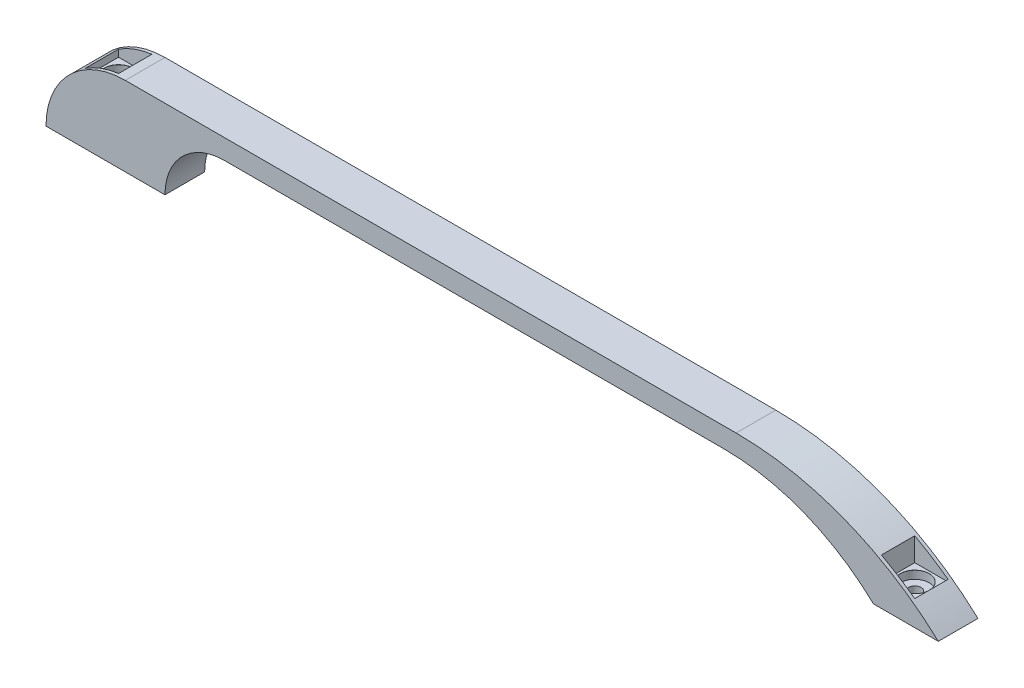
ISO-10303-21;
HEADER;
FILE_DESCRIPTION(('STEP AP214'),'2;1');
FILE_NAME('part.step','',(''),(''),'','','');
FILE_SCHEMA(('AUTOMOTIVE_DESIGN { 1 0 10303 214 1 1 1 1 }'));
ENDSEC;
DATA;
#1=APPLICATION_CONTEXT('core data for automotive mechanical design processes');
#2=APPLICATION_PROTOCOL_DEFINITION('international standard','automotive_design',2000,#1);
#3=PRODUCT_CONTEXT('',#1,'mechanical');
#4=PRODUCT('Part','Part','',(#3));
#5=PRODUCT_RELATED_PRODUCT_CATEGORY('part','',(#4));
#6=PRODUCT_DEFINITION_FORMATION('','',#4);
#7=PRODUCT_DEFINITION_CONTEXT('part definition',#1,'design');
#8=PRODUCT_DEFINITION('design','',#6,#7);
#9=PRODUCT_DEFINITION_SHAPE('','',#8);
#10=(LENGTH_UNIT() NAMED_UNIT(*) SI_UNIT(.MILLI.,.METRE.));
#11=(NAMED_UNIT(*) PLANE_ANGLE_UNIT() SI_UNIT($,.RADIAN.));
#12=(NAMED_UNIT(*) SI_UNIT($,.STERADIAN.) SOLID_ANGLE_UNIT());
#13=UNCERTAINTY_MEASURE_WITH_UNIT(LENGTH_MEASURE(1.E-05),#10,'distance_accuracy_value','');
#14=(GEOMETRIC_REPRESENTATION_CONTEXT(3) GLOBAL_UNCERTAINTY_ASSIGNED_CONTEXT((#13)) GLOBAL_UNIT_ASSIGNED_CONTEXT((#10,
#11,#12)) REPRESENTATION_CONTEXT('',''));
#15=CARTESIAN_POINT('',(0.,0.,0.));
#16=DIRECTION('',(0.,0.,1.));
#17=DIRECTION('',(1.,0.,0.));
#18=AXIS2_PLACEMENT_3D('',#15,#16,#17);
#19=CARTESIAN_POINT('',(348.019609728144,-110.,20.));
#20=DIRECTION('',(0.,0.,-1.));
#21=DIRECTION('',(-1.,0.,0.));
#22=AXIS2_PLACEMENT_3D('',#19,#20,#21);
#23=CYLINDRICAL_SURFACE('',#22,150.);
#24=CARTESIAN_POINT('',(348.019609728144,-110.,0.));
#25=DIRECTION('',(0.,0.,1.));
#26=DIRECTION('',(-1.,0.,0.));
#27=AXIS2_PLACEMENT_3D('',#24,#25,#26);
#28=CIRCLE('',#27,150.);
#29=CARTESIAN_POINT('',(450.,0.,0.));
#30=VERTEX_POINT('',#29);
#31=CARTESIAN_POINT('',(348.019609728144,40.,0.));
#32=VERTEX_POINT('',#31);
#33=EDGE_CURVE('E276',#30,#32,#28,.T.);
#34=ORIENTED_EDGE('',*,*,#33,.T.);
#35=DIRECTION('',(0.,0.,-1.));
#36=VECTOR('',#35,1.);
#37=CARTESIAN_POINT('',(348.019609728144,40.,20.));
#38=LINE('',#37,#36);
#39=CARTESIAN_POINT('',(348.019609728144,40.,20.));
#40=VERTEX_POINT('',#39);
#41=EDGE_CURVE('E284',#40,#32,#38,.T.);
#42=ORIENTED_EDGE('',*,*,#41,.F.);
#43=CARTESIAN_POINT('',(348.019609728144,-110.,20.));
#44=DIRECTION('',(0.,0.,1.));
#45=DIRECTION('',(-1.,0.,0.));
#46=AXIS2_PLACEMENT_3D('',#43,#44,#45);
#47=CIRCLE('',#46,150.);
#48=CARTESIAN_POINT('',(450.,0.,20.));
#49=VERTEX_POINT('',#48);
#50=EDGE_CURVE('E250',#49,#40,#47,.T.);
#51=ORIENTED_EDGE('',*,*,#50,.F.);
#52=DIRECTION('',(0.,0.,-1.));
#53=VECTOR('',#52,1.);
#54=CARTESIAN_POINT('',(450.,0.,20.));
#55=LINE('',#54,#53);
#56=EDGE_CURVE('E288',#49,#30,#55,.T.);
#57=ORIENTED_EDGE('',*,*,#56,.T.);
#58=EDGE_LOOP('',(#34,#42,#51,#57));
#59=FACE_BOUND('',#58,.T.);
#60=DIRECTION('',(0.,0.,-1.));
#61=VECTOR('',#60,1.);
#62=CARTESIAN_POINT('',(419.7,21.7646449184092,20.));
#63=LINE('',#62,#61);
#64=CARTESIAN_POINT('',(419.7,21.7646449184092,1.6));
#65=VERTEX_POINT('',#64);
#66=CARTESIAN_POINT('',(419.7,21.7646449184092,18.4));
#67=VERTEX_POINT('',#66);
#68=EDGE_CURVE('E11',#65,#67,#63,.F.);
#69=ORIENTED_EDGE('',*,*,#68,.F.);
#70=CARTESIAN_POINT('',(348.019609728144,-110.,1.60000000000001));
#71=DIRECTION('',(0.,0.,1.));
#72=DIRECTION('',(1.,0.,0.));
#73=AXIS2_PLACEMENT_3D('',#70,#71,#72);
#74=CIRCLE('',#73,150.);
#75=CARTESIAN_POINT('',(436.5,11.1248138794859,1.6));
#76=VERTEX_POINT('',#75);
#77=EDGE_CURVE('E324',#76,#65,#74,.T.);
#78=ORIENTED_EDGE('',*,*,#77,.F.);
#79=DIRECTION('',(0.,0.,-1.));
#80=VECTOR('',#79,1.);
#81=CARTESIAN_POINT('',(436.5,11.1248138794859,20.));
#82=LINE('',#81,#80);
#83=CARTESIAN_POINT('',(436.5,11.1248138794859,18.4));
#84=VERTEX_POINT('',#83);
#85=EDGE_CURVE('E327',#84,#76,#82,.T.);
#86=ORIENTED_EDGE('',*,*,#85,.F.);
#87=CARTESIAN_POINT('',(348.019609728144,-110.,18.4));
#88=DIRECTION('',(0.,0.,-1.));
#89=DIRECTION('',(-1.,0.,0.));
#90=AXIS2_PLACEMENT_3D('',#87,#88,#89);
#91=CIRCLE('',#90,150.);
#92=EDGE_CURVE('E52',#67,#84,#91,.T.);
#93=ORIENTED_EDGE('',*,*,#92,.F.);
#94=EDGE_LOOP('',(#69,#78,#86,#93));
#95=FACE_BOUND('',#94,.T.);
#96=ADVANCED_FACE('F42',(#59,#95),#23,.T.);
#97=CARTESIAN_POINT('',(40.,0.,20.));
#98=DIRECTION('',(0.,0.,-1.));
#99=DIRECTION('',(-1.,0.,0.));
#100=AXIS2_PLACEMENT_3D('',#97,#98,#99);
#101=CYLINDRICAL_SURFACE('',#100,40.);
#102=CARTESIAN_POINT('',(40.,0.,0.));
#103=DIRECTION('',(0.,0.,1.));
#104=DIRECTION('',(1.,0.,0.));
#105=AXIS2_PLACEMENT_3D('',#102,#103,#104);
#106=CIRCLE('',#105,40.);
#107=CARTESIAN_POINT('',(40.,40.,0.));
#108=VERTEX_POINT('',#107);
#109=CARTESIAN_POINT('',(0.,0.,0.));
#110=VERTEX_POINT('',#109);
#111=EDGE_CURVE('E229',#108,#110,#106,.T.);
#112=ORIENTED_EDGE('',*,*,#111,.T.);
#113=DIRECTION('',(0.,0.,-1.));
#114=VECTOR('',#113,1.);
#115=CARTESIAN_POINT('',(0.,0.,20.));
#116=LINE('',#115,#114);
#117=CARTESIAN_POINT('',(0.,0.,20.));
#118=VERTEX_POINT('',#117);
#119=EDGE_CURVE('E308',#118,#110,#116,.T.);
#120=ORIENTED_EDGE('',*,*,#119,.F.);
#121=CARTESIAN_POINT('',(40.,0.,20.));
#122=DIRECTION('',(0.,0.,1.));
#123=DIRECTION('',(1.,0.,0.));
#124=AXIS2_PLACEMENT_3D('',#121,#122,#123);
#125=CIRCLE('',#124,40.);
#126=CARTESIAN_POINT('',(40.,40.,20.));
#127=VERTEX_POINT('',#126);
#128=EDGE_CURVE('E230',#127,#118,#125,.T.);
#129=ORIENTED_EDGE('',*,*,#128,.F.);
#130=DIRECTION('',(0.,0.,-1.));
#131=VECTOR('',#130,1.);
#132=CARTESIAN_POINT('',(40.,40.,20.));
#133=LINE('',#132,#131);
#134=EDGE_CURVE('E256',#127,#108,#133,.T.);
#135=ORIENTED_EDGE('',*,*,#134,.T.);
#136=EDGE_LOOP('',(#112,#120,#129,#135));
#137=FACE_BOUND('',#136,.T.);
#138=CARTESIAN_POINT('',(40.,0.,1.6));
#139=DIRECTION('',(0.,0.,1.));
#140=DIRECTION('',(1.,0.,0.));
#141=AXIS2_PLACEMENT_3D('',#138,#139,#140);
#142=CIRCLE('',#141,40.);
#143=CARTESIAN_POINT('',(35.,39.6862696659689,1.6));
#144=VERTEX_POINT('',#143);
#145=CARTESIAN_POINT('',(18.2,33.5374417629014,1.6));
#146=VERTEX_POINT('',#145);
#147=EDGE_CURVE('E321',#144,#146,#142,.T.);
#148=ORIENTED_EDGE('',*,*,#147,.F.);
#149=DIRECTION('',(0.,0.,-1.));
#150=VECTOR('',#149,1.);
#151=CARTESIAN_POINT('',(35.,39.6862696659689,20.));
#152=LINE('',#151,#150);
#153=CARTESIAN_POINT('',(35.,39.6862696659689,18.4));
#154=VERTEX_POINT('',#153);
#155=EDGE_CURVE('E312',#154,#144,#152,.T.);
#156=ORIENTED_EDGE('',*,*,#155,.F.);
#157=CARTESIAN_POINT('',(40.,0.,18.4));
#158=DIRECTION('',(0.,0.,-1.));
#159=DIRECTION('',(-1.,0.,0.));
#160=AXIS2_PLACEMENT_3D('',#157,#158,#159);
#161=CIRCLE('',#160,40.);
#162=CARTESIAN_POINT('',(18.2,33.5374417629014,18.4));
#163=VERTEX_POINT('',#162);
#164=EDGE_CURVE('E315',#163,#154,#161,.T.);
#165=ORIENTED_EDGE('',*,*,#164,.F.);
#166=DIRECTION('',(0.,0.,-1.));
#167=VECTOR('',#166,1.);
#168=CARTESIAN_POINT('',(18.2,33.5374417629014,20.));
#169=LINE('',#168,#167);
#170=EDGE_CURVE('E318',#146,#163,#169,.F.);
#171=ORIENTED_EDGE('',*,*,#170,.F.);
#172=EDGE_LOOP('',(#148,#156,#165,#171));
#173=FACE_BOUND('',#172,.T.);
#174=ADVANCED_FACE('F44',(#137,#173),#101,.T.);
#175=CARTESIAN_POINT('',(0.,0.,20.));
#176=DIRECTION('',(0.,1.,0.));
#177=DIRECTION('',(0.,0.,1.));
#178=AXIS2_PLACEMENT_3D('',#175,#176,#177);
#179=PLANE('',#178);
#180=CARTESIAN_POINT('',(26.6,0.,10.));
#181=DIRECTION('',(0.,1.,0.));
#182=DIRECTION('',(0.,0.,1.));
#183=AXIS2_PLACEMENT_3D('',#180,#181,#182);
#184=CIRCLE('',#183,3.19999999999999);
#185=CARTESIAN_POINT('',(26.6,0.,13.2));
#186=VERTEX_POINT('',#185);
#187=EDGE_CURVE('E46',#186,#186,#184,.T.);
#188=ORIENTED_EDGE('',*,*,#187,.T.);
#189=EDGE_LOOP('',(#188));
#190=FACE_BOUND('',#189,.T.);
#191=DIRECTION('',(1.,0.,0.));
#192=VECTOR('',#191,1.);
#193=CARTESIAN_POINT('',(0.,0.,0.));
#194=LINE('',#193,#192);
#195=CARTESIAN_POINT('',(60.,0.,0.));
#196=VERTEX_POINT('',#195);
#197=EDGE_CURVE('E260',#110,#196,#194,.T.);
#198=ORIENTED_EDGE('',*,*,#197,.T.);
#199=DIRECTION('',(0.,0.,-1.));
#200=VECTOR('',#199,1.);
#201=CARTESIAN_POINT('',(60.,0.,20.));
#202=LINE('',#201,#200);
#203=CARTESIAN_POINT('',(60.,0.,20.));
#204=VERTEX_POINT('',#203);
#205=EDGE_CURVE('E304',#204,#196,#202,.T.);
#206=ORIENTED_EDGE('',*,*,#205,.F.);
#207=DIRECTION('',(1.,0.,0.));
#208=VECTOR('',#207,1.);
#209=CARTESIAN_POINT('',(0.,0.,20.));
#210=LINE('',#209,#208);
#211=EDGE_CURVE('E234',#118,#204,#210,.T.);
#212=ORIENTED_EDGE('',*,*,#211,.F.);
#213=ORIENTED_EDGE('',*,*,#119,.T.);
#214=EDGE_LOOP('',(#198,#206,#212,#213));
#215=FACE_BOUND('',#214,.T.);
#216=ADVANCED_FACE('F353',(#190,#215),#179,.F.);
#217=CARTESIAN_POINT('',(90.,0.,20.));
#218=DIRECTION('',(0.,0.,-1.));
#219=DIRECTION('',(-1.,0.,0.));
#220=AXIS2_PLACEMENT_3D('',#217,#218,#219);
#221=CYLINDRICAL_SURFACE('',#220,30.);
#222=CARTESIAN_POINT('',(90.,0.,0.));
#223=DIRECTION('',(0.,0.,-1.));
#224=DIRECTION('',(-1.,0.,0.));
#225=AXIS2_PLACEMENT_3D('',#222,#223,#224);
#226=CIRCLE('',#225,30.);
#227=CARTESIAN_POINT('',(90.,30.,0.));
#228=VERTEX_POINT('',#227);
#229=EDGE_CURVE('E263',#196,#228,#226,.T.);
#230=ORIENTED_EDGE('',*,*,#229,.T.);
#231=DIRECTION('',(0.,0.,-1.));
#232=VECTOR('',#231,1.);
#233=CARTESIAN_POINT('',(90.,30.,20.));
#234=LINE('',#233,#232);
#235=CARTESIAN_POINT('',(90.,30.,20.));
#236=VERTEX_POINT('',#235);
#237=EDGE_CURVE('E300',#236,#228,#234,.T.);
#238=ORIENTED_EDGE('',*,*,#237,.F.);
#239=CARTESIAN_POINT('',(90.,0.,20.));
#240=DIRECTION('',(0.,0.,-1.));
#241=DIRECTION('',(-1.,0.,0.));
#242=AXIS2_PLACEMENT_3D('',#239,#240,#241);
#243=CIRCLE('',#242,30.);
#244=EDGE_CURVE('E238',#204,#236,#243,.T.);
#245=ORIENTED_EDGE('',*,*,#244,.F.);
#246=ORIENTED_EDGE('',*,*,#205,.T.);
#247=EDGE_LOOP('',(#230,#238,#245,#246));
#248=FACE_BOUND('',#247,.T.);
#249=ADVANCED_FACE('F370',(#248),#221,.F.);
#250=CARTESIAN_POINT('',(342.,30.,20.));
#251=DIRECTION('',(0.,1.,0.));
#252=DIRECTION('',(-1.,0.,0.));
#253=AXIS2_PLACEMENT_3D('',#250,#251,#252);
#254=PLANE('',#253);
#255=DIRECTION('',(1.,0.,0.));
#256=VECTOR('',#255,1.);
#257=CARTESIAN_POINT('',(342.,30.,0.));
#258=LINE('',#257,#256);
#259=CARTESIAN_POINT('',(342.,30.,0.));
#260=VERTEX_POINT('',#259);
#261=EDGE_CURVE('E267',#228,#260,#258,.T.);
#262=ORIENTED_EDGE('',*,*,#261,.T.);
#263=DIRECTION('',(0.,0.,-1.));
#264=VECTOR('',#263,1.);
#265=CARTESIAN_POINT('',(342.,30.,20.));
#266=LINE('',#265,#264);
#267=CARTESIAN_POINT('',(342.,30.,20.));
#268=VERTEX_POINT('',#267);
#269=EDGE_CURVE('E296',#268,#260,#266,.T.);
#270=ORIENTED_EDGE('',*,*,#269,.F.);
#271=DIRECTION('',(1.,0.,0.));
#272=VECTOR('',#271,1.);
#273=CARTESIAN_POINT('',(90.,30.,20.));
#274=LINE('',#273,#272);
#275=EDGE_CURVE('E241',#236,#268,#274,.T.);
#276=ORIENTED_EDGE('',*,*,#275,.F.);
#277=ORIENTED_EDGE('',*,*,#237,.T.);
#278=EDGE_LOOP('',(#262,#270,#276,#277));
#279=FACE_BOUND('',#278,.T.);
#280=ADVANCED_FACE('F366',(#279),#254,.F.);
#281=CARTESIAN_POINT('',(341.782107923545,-79.9997841954384,20.));
#282=DIRECTION('',(0.,0.,-1.));
#283=DIRECTION('',(-1.,0.,0.));
#284=AXIS2_PLACEMENT_3D('',#281,#282,#283);
#285=CYLINDRICAL_SURFACE('',#284,110.);
#286=CARTESIAN_POINT('',(341.782107923545,-79.9997841954384,0.));
#287=DIRECTION('',(0.,0.,-1.));
#288=DIRECTION('',(-1.,0.,0.));
#289=AXIS2_PLACEMENT_3D('',#286,#287,#288);
#290=CIRCLE('',#289,110.);
#291=CARTESIAN_POINT('',(417.280680947698,0.,0.));
#292=VERTEX_POINT('',#291);
#293=EDGE_CURVE('E270',#260,#292,#290,.T.);
#294=ORIENTED_EDGE('',*,*,#293,.T.);
#295=DIRECTION('',(0.,0.,-1.));
#296=VECTOR('',#295,1.);
#297=CARTESIAN_POINT('',(417.280680947698,0.,20.));
#298=LINE('',#297,#296);
#299=CARTESIAN_POINT('',(417.280680947698,0.,20.));
#300=VERTEX_POINT('',#299);
#301=EDGE_CURVE('E292',#300,#292,#298,.T.);
#302=ORIENTED_EDGE('',*,*,#301,.F.);
#303=CARTESIAN_POINT('',(341.782107923545,-79.9997841954384,20.));
#304=DIRECTION('',(0.,0.,-1.));
#305=DIRECTION('',(-1.,0.,0.));
#306=AXIS2_PLACEMENT_3D('',#303,#304,#305);
#307=CIRCLE('',#306,110.);
#308=EDGE_CURVE('E244',#268,#300,#307,.T.);
#309=ORIENTED_EDGE('',*,*,#308,.F.);
#310=ORIENTED_EDGE('',*,*,#269,.T.);
#311=EDGE_LOOP('',(#294,#302,#309,#310));
#312=FACE_BOUND('',#311,.T.);
#313=ADVANCED_FACE('F362',(#312),#285,.F.);
#314=CARTESIAN_POINT('',(450.,0.,20.));
#315=DIRECTION('',(0.,1.,0.));
#316=DIRECTION('',(-1.,0.,0.));
#317=AXIS2_PLACEMENT_3D('',#314,#315,#316);
#318=PLANE('',#317);
#319=CARTESIAN_POINT('',(428.1,0.,10.));
#320=DIRECTION('',(0.,1.,0.));
#321=DIRECTION('',(-1.,0.,0.));
#322=AXIS2_PLACEMENT_3D('',#319,#320,#321);
#323=CIRCLE('',#322,3.19999999999998);
#324=CARTESIAN_POINT('',(424.9,0.,10.));
#325=VERTEX_POINT('',#324);
#326=EDGE_CURVE('E184',#325,#325,#323,.T.);
#327=ORIENTED_EDGE('',*,*,#326,.T.);
#328=EDGE_LOOP('',(#327));
#329=FACE_BOUND('',#328,.T.);
#330=DIRECTION('',(1.,0.,0.));
#331=VECTOR('',#330,1.);
#332=CARTESIAN_POINT('',(450.,0.,0.));
#333=LINE('',#332,#331);
#334=EDGE_CURVE('E273',#292,#30,#333,.T.);
#335=ORIENTED_EDGE('',*,*,#334,.T.);
#336=ORIENTED_EDGE('',*,*,#56,.F.);
#337=DIRECTION('',(1.,0.,0.));
#338=VECTOR('',#337,1.);
#339=CARTESIAN_POINT('',(450.,0.,20.));
#340=LINE('',#339,#338);
#341=EDGE_CURVE('E247',#300,#49,#340,.T.);
#342=ORIENTED_EDGE('',*,*,#341,.F.);
#343=ORIENTED_EDGE('',*,*,#301,.T.);
#344=EDGE_LOOP('',(#335,#336,#342,#343));
#345=FACE_BOUND('',#344,.T.);
#346=ADVANCED_FACE('F359',(#329,#345),#318,.F.);
#347=CARTESIAN_POINT('',(40.,40.,20.));
#348=DIRECTION('',(0.,-1.,0.));
#349=DIRECTION('',(1.,0.,0.));
#350=AXIS2_PLACEMENT_3D('',#347,#348,#349);
#351=PLANE('',#350);
#352=DIRECTION('',(-1.,0.,0.));
#353=VECTOR('',#352,1.);
#354=CARTESIAN_POINT('',(40.,40.,0.));
#355=LINE('',#354,#353);
#356=EDGE_CURVE('E235',#32,#108,#355,.T.);
#357=ORIENTED_EDGE('',*,*,#356,.T.);
#358=ORIENTED_EDGE('',*,*,#134,.F.);
#359=DIRECTION('',(-1.,0.,0.));
#360=VECTOR('',#359,1.);
#361=CARTESIAN_POINT('',(40.,40.,20.));
#362=LINE('',#361,#360);
#363=EDGE_CURVE('E253',#40,#127,#362,.T.);
#364=ORIENTED_EDGE('',*,*,#363,.F.);
#365=ORIENTED_EDGE('',*,*,#41,.T.);
#366=EDGE_LOOP('',(#357,#358,#364,#365));
#367=FACE_BOUND('',#366,.T.);
#368=ADVANCED_FACE('F357',(#367),#351,.F.);
#369=CARTESIAN_POINT('',(40.,0.,20.));
#370=DIRECTION('',(0.,0.,1.));
#371=DIRECTION('',(1.,0.,0.));
#372=AXIS2_PLACEMENT_3D('',#369,#370,#371);
#373=PLANE('',#372);
#374=ORIENTED_EDGE('',*,*,#128,.T.);
#375=ORIENTED_EDGE('',*,*,#211,.T.);
#376=ORIENTED_EDGE('',*,*,#244,.T.);
#377=ORIENTED_EDGE('',*,*,#275,.T.);
#378=ORIENTED_EDGE('',*,*,#308,.T.);
#379=ORIENTED_EDGE('',*,*,#341,.T.);
#380=ORIENTED_EDGE('',*,*,#50,.T.);
#381=ORIENTED_EDGE('',*,*,#363,.T.);
#382=EDGE_LOOP('',(#374,#375,#376,#377,#378,#379,#380,#381));
#383=FACE_BOUND('',#382,.T.);
#384=ADVANCED_FACE('F397',(#383),#373,.T.);
#385=CARTESIAN_POINT('',(40.,0.,0.));
#386=DIRECTION('',(0.,0.,1.));
#387=DIRECTION('',(1.,0.,0.));
#388=AXIS2_PLACEMENT_3D('',#385,#386,#387);
#389=PLANE('',#388);
#390=ORIENTED_EDGE('',*,*,#111,.F.);
#391=ORIENTED_EDGE('',*,*,#356,.F.);
#392=ORIENTED_EDGE('',*,*,#33,.F.);
#393=ORIENTED_EDGE('',*,*,#334,.F.);
#394=ORIENTED_EDGE('',*,*,#293,.F.);
#395=ORIENTED_EDGE('',*,*,#261,.F.);
#396=ORIENTED_EDGE('',*,*,#229,.F.);
#397=ORIENTED_EDGE('',*,*,#197,.F.);
#398=EDGE_LOOP('',(#390,#391,#392,#393,#394,#395,#396,#397));
#399=FACE_BOUND('',#398,.T.);
#400=ADVANCED_FACE('F388',(#399),#389,.F.);
#401=CARTESIAN_POINT('',(35.,50.,1.6));
#402=DIRECTION('',(0.,0.,1.));
#403=DIRECTION('',(1.,0.,0.));
#404=AXIS2_PLACEMENT_3D('',#401,#402,#403);
#405=PLANE('',#404);
#406=ORIENTED_EDGE('',*,*,#147,.T.);
#407=DIRECTION('',(0.,-1.,0.));
#408=VECTOR('',#407,1.);
#409=CARTESIAN_POINT('',(18.2,50.,1.6));
#410=LINE('',#409,#408);
#411=CARTESIAN_POINT('',(18.2,30.,1.6));
#412=VERTEX_POINT('',#411);
#413=EDGE_CURVE('E226',#146,#412,#410,.T.);
#414=ORIENTED_EDGE('',*,*,#413,.T.);
#415=DIRECTION('',(-1.,0.,0.));
#416=VECTOR('',#415,1.);
#417=CARTESIAN_POINT('',(35.,30.,1.6));
#418=LINE('',#417,#416);
#419=CARTESIAN_POINT('',(35.,30.,1.6));
#420=VERTEX_POINT('',#419);
#421=EDGE_CURVE('E167',#420,#412,#418,.T.);
#422=ORIENTED_EDGE('',*,*,#421,.F.);
#423=DIRECTION('',(0.,-1.,0.));
#424=VECTOR('',#423,1.);
#425=CARTESIAN_POINT('',(35.,50.,1.6));
#426=LINE('',#425,#424);
#427=EDGE_CURVE('E218',#144,#420,#426,.T.);
#428=ORIENTED_EDGE('',*,*,#427,.F.);
#429=EDGE_LOOP('',(#406,#414,#422,#428));
#430=FACE_BOUND('',#429,.T.);
#431=ADVANCED_FACE('F417',(#430),#405,.T.);
#432=CARTESIAN_POINT('',(18.2,50.,1.6));
#433=DIRECTION('',(1.,0.,0.));
#434=DIRECTION('',(0.,0.,-1.));
#435=AXIS2_PLACEMENT_3D('',#432,#433,#434);
#436=PLANE('',#435);
#437=ORIENTED_EDGE('',*,*,#170,.T.);
#438=DIRECTION('',(0.,-1.,0.));
#439=VECTOR('',#438,1.);
#440=CARTESIAN_POINT('',(18.2,50.,18.4));
#441=LINE('',#440,#439);
#442=CARTESIAN_POINT('',(18.2,30.,18.4));
#443=VERTEX_POINT('',#442);
#444=EDGE_CURVE('E223',#163,#443,#441,.T.);
#445=ORIENTED_EDGE('',*,*,#444,.T.);
#446=DIRECTION('',(0.,0.,1.));
#447=VECTOR('',#446,1.);
#448=CARTESIAN_POINT('',(18.2,30.,1.6));
#449=LINE('',#448,#447);
#450=EDGE_CURVE('E206',#412,#443,#449,.T.);
#451=ORIENTED_EDGE('',*,*,#450,.F.);
#452=ORIENTED_EDGE('',*,*,#413,.F.);
#453=EDGE_LOOP('',(#437,#445,#451,#452));
#454=FACE_BOUND('',#453,.T.);
#455=ADVANCED_FACE('F421',(#454),#436,.T.);
#456=CARTESIAN_POINT('',(18.2,50.,18.4));
#457=DIRECTION('',(0.,0.,-1.));
#458=DIRECTION('',(-1.,0.,0.));
#459=AXIS2_PLACEMENT_3D('',#456,#457,#458);
#460=PLANE('',#459);
#461=ORIENTED_EDGE('',*,*,#164,.T.);
#462=DIRECTION('',(0.,-1.,0.));
#463=VECTOR('',#462,1.);
#464=CARTESIAN_POINT('',(35.,50.,18.4));
#465=LINE('',#464,#463);
#466=CARTESIAN_POINT('',(35.,30.,18.4));
#467=VERTEX_POINT('',#466);
#468=EDGE_CURVE('E68',#154,#467,#465,.T.);
#469=ORIENTED_EDGE('',*,*,#468,.T.);
#470=DIRECTION('',(1.,0.,0.));
#471=VECTOR('',#470,1.);
#472=CARTESIAN_POINT('',(18.2,30.,18.4));
#473=LINE('',#472,#471);
#474=EDGE_CURVE('E210',#443,#467,#473,.T.);
#475=ORIENTED_EDGE('',*,*,#474,.F.);
#476=ORIENTED_EDGE('',*,*,#444,.F.);
#477=EDGE_LOOP('',(#461,#469,#475,#476));
#478=FACE_BOUND('',#477,.T.);
#479=ADVANCED_FACE('F425',(#478),#460,.T.);
#480=CARTESIAN_POINT('',(35.,50.,18.4));
#481=DIRECTION('',(-1.,0.,0.));
#482=DIRECTION('',(0.,0.,1.));
#483=AXIS2_PLACEMENT_3D('',#480,#481,#482);
#484=PLANE('',#483);
#485=ORIENTED_EDGE('',*,*,#155,.T.);
#486=ORIENTED_EDGE('',*,*,#427,.T.);
#487=DIRECTION('',(0.,0.,-1.));
#488=VECTOR('',#487,1.);
#489=CARTESIAN_POINT('',(35.,30.,18.4));
#490=LINE('',#489,#488);
#491=EDGE_CURVE('E214',#467,#420,#490,.T.);
#492=ORIENTED_EDGE('',*,*,#491,.F.);
#493=ORIENTED_EDGE('',*,*,#468,.F.);
#494=EDGE_LOOP('',(#485,#486,#492,#493));
#495=FACE_BOUND('',#494,.T.);
#496=ADVANCED_FACE('F429',(#495),#484,.T.);
#497=CARTESIAN_POINT('',(0.,30.,0.));
#498=DIRECTION('',(0.,1.,0.));
#499=DIRECTION('',(0.,0.,1.));
#500=AXIS2_PLACEMENT_3D('',#497,#498,#499);
#501=PLANE('',#500);
#502=CARTESIAN_POINT('',(26.6,30.,10.));
#503=DIRECTION('',(0.,1.,0.));
#504=DIRECTION('',(0.,0.,1.));
#505=AXIS2_PLACEMENT_3D('',#502,#503,#504);
#506=CIRCLE('',#505,7.2985);
#507=CARTESIAN_POINT('',(26.6,30.,17.2985));
#508=VERTEX_POINT('',#507);
#509=EDGE_CURVE('E694',#508,#508,#506,.T.);
#510=ORIENTED_EDGE('',*,*,#509,.F.);
#511=EDGE_LOOP('',(#510));
#512=FACE_BOUND('',#511,.T.);
#513=ORIENTED_EDGE('',*,*,#421,.T.);
#514=ORIENTED_EDGE('',*,*,#450,.T.);
#515=ORIENTED_EDGE('',*,*,#474,.T.);
#516=ORIENTED_EDGE('',*,*,#491,.T.);
#517=EDGE_LOOP('',(#513,#514,#515,#516));
#518=FACE_BOUND('',#517,.T.);
#519=ADVANCED_FACE('F433',(#512,#518),#501,.T.);
#520=CARTESIAN_POINT('',(419.7,30.,1.6));
#521=DIRECTION('',(1.,0.,0.));
#522=DIRECTION('',(0.,0.,-1.));
#523=AXIS2_PLACEMENT_3D('',#520,#521,#522);
#524=PLANE('',#523);
#525=ORIENTED_EDGE('',*,*,#68,.T.);
#526=DIRECTION('',(0.,-1.,0.));
#527=VECTOR('',#526,1.);
#528=CARTESIAN_POINT('',(419.7,30.,18.4));
#529=LINE('',#528,#527);
#530=CARTESIAN_POINT('',(419.7,10.,18.4));
#531=VERTEX_POINT('',#530);
#532=EDGE_CURVE('E157',#67,#531,#529,.T.);
#533=ORIENTED_EDGE('',*,*,#532,.T.);
#534=DIRECTION('',(0.,0.,1.));
#535=VECTOR('',#534,1.);
#536=CARTESIAN_POINT('',(419.7,10.,1.6));
#537=LINE('',#536,#535);
#538=CARTESIAN_POINT('',(419.7,10.,1.6));
#539=VERTEX_POINT('',#538);
#540=EDGE_CURVE('E162',#539,#531,#537,.T.);
#541=ORIENTED_EDGE('',*,*,#540,.F.);
#542=DIRECTION('',(0.,-1.,0.));
#543=VECTOR('',#542,1.);
#544=CARTESIAN_POINT('',(419.7,30.,1.6));
#545=LINE('',#544,#543);
#546=EDGE_CURVE('E196',#65,#539,#545,.T.);
#547=ORIENTED_EDGE('',*,*,#546,.F.);
#548=EDGE_LOOP('',(#525,#533,#541,#547));
#549=FACE_BOUND('',#548,.T.);
#550=ADVANCED_FACE('F159',(#549),#524,.T.);
#551=CARTESIAN_POINT('',(419.7,30.,18.4));
#552=DIRECTION('',(0.,0.,-1.));
#553=DIRECTION('',(-1.,0.,0.));
#554=AXIS2_PLACEMENT_3D('',#551,#552,#553);
#555=PLANE('',#554);
#556=ORIENTED_EDGE('',*,*,#92,.T.);
#557=DIRECTION('',(0.,-1.,0.));
#558=VECTOR('',#557,1.);
#559=CARTESIAN_POINT('',(436.5,30.,18.4));
#560=LINE('',#559,#558);
#561=CARTESIAN_POINT('',(436.5,10.,18.4));
#562=VERTEX_POINT('',#561);
#563=EDGE_CURVE('E168',#84,#562,#560,.T.);
#564=ORIENTED_EDGE('',*,*,#563,.T.);
#565=DIRECTION('',(1.,0.,0.));
#566=VECTOR('',#565,1.);
#567=CARTESIAN_POINT('',(419.7,10.,18.4));
#568=LINE('',#567,#566);
#569=EDGE_CURVE('E171',#531,#562,#568,.T.);
#570=ORIENTED_EDGE('',*,*,#569,.F.);
#571=ORIENTED_EDGE('',*,*,#532,.F.);
#572=EDGE_LOOP('',(#556,#564,#570,#571));
#573=FACE_BOUND('',#572,.T.);
#574=ADVANCED_FACE('F172',(#573),#555,.T.);
#575=CARTESIAN_POINT('',(436.5,30.,18.4));
#576=DIRECTION('',(-1.,0.,0.));
#577=DIRECTION('',(0.,0.,1.));
#578=AXIS2_PLACEMENT_3D('',#575,#576,#577);
#579=PLANE('',#578);
#580=ORIENTED_EDGE('',*,*,#85,.T.);
#581=DIRECTION('',(0.,-1.,0.));
#582=VECTOR('',#581,1.);
#583=CARTESIAN_POINT('',(436.5,30.,1.6));
#584=LINE('',#583,#582);
#585=CARTESIAN_POINT('',(436.5,10.,1.6));
#586=VERTEX_POINT('',#585);
#587=EDGE_CURVE('E60',#76,#586,#584,.T.);
#588=ORIENTED_EDGE('',*,*,#587,.T.);
#589=DIRECTION('',(0.,0.,-1.));
#590=VECTOR('',#589,1.);
#591=CARTESIAN_POINT('',(436.5,10.,18.4));
#592=LINE('',#591,#590);
#593=EDGE_CURVE('E178',#562,#586,#592,.T.);
#594=ORIENTED_EDGE('',*,*,#593,.F.);
#595=ORIENTED_EDGE('',*,*,#563,.F.);
#596=EDGE_LOOP('',(#580,#588,#594,#595));
#597=FACE_BOUND('',#596,.T.);
#598=ADVANCED_FACE('F334',(#597),#579,.T.);
#599=CARTESIAN_POINT('',(436.5,30.,1.6));
#600=DIRECTION('',(0.,0.,1.));
#601=DIRECTION('',(1.,0.,0.));
#602=AXIS2_PLACEMENT_3D('',#599,#600,#601);
#603=PLANE('',#602);
#604=ORIENTED_EDGE('',*,*,#77,.T.);
#605=ORIENTED_EDGE('',*,*,#546,.T.);
#606=DIRECTION('',(-1.,0.,0.));
#607=VECTOR('',#606,1.);
#608=CARTESIAN_POINT('',(436.5,10.,1.6));
#609=LINE('',#608,#607);
#610=EDGE_CURVE('E182',#586,#539,#609,.T.);
#611=ORIENTED_EDGE('',*,*,#610,.F.);
#612=ORIENTED_EDGE('',*,*,#587,.F.);
#613=EDGE_LOOP('',(#604,#605,#611,#612));
#614=FACE_BOUND('',#613,.T.);
#615=ADVANCED_FACE('F336',(#614),#603,.T.);
#616=CARTESIAN_POINT('',(0.,10.,0.));
#617=DIRECTION('',(0.,1.,0.));
#618=DIRECTION('',(0.,0.,1.));
#619=AXIS2_PLACEMENT_3D('',#616,#617,#618);
#620=PLANE('',#619);
#621=CARTESIAN_POINT('',(428.1,10.,10.));
#622=DIRECTION('',(0.,1.,0.));
#623=DIRECTION('',(0.,0.,1.));
#624=AXIS2_PLACEMENT_3D('',#621,#622,#623);
#625=CIRCLE('',#624,7.29849999999999);
#626=CARTESIAN_POINT('',(428.1,10.,17.2985));
#627=VERTEX_POINT('',#626);
#628=EDGE_CURVE('E708',#627,#627,#625,.T.);
#629=ORIENTED_EDGE('',*,*,#628,.F.);
#630=EDGE_LOOP('',(#629));
#631=FACE_BOUND('',#630,.T.);
#632=ORIENTED_EDGE('',*,*,#540,.T.);
#633=ORIENTED_EDGE('',*,*,#569,.T.);
#634=ORIENTED_EDGE('',*,*,#593,.T.);
#635=ORIENTED_EDGE('',*,*,#610,.T.);
#636=EDGE_LOOP('',(#632,#633,#634,#635));
#637=FACE_BOUND('',#636,.T.);
#638=ADVANCED_FACE('F181',(#631,#637),#620,.T.);
#639=CARTESIAN_POINT('',(428.1,10.,10.));
#640=DIRECTION('',(0.,1.,0.));
#641=DIRECTION('',(0.,0.,1.));
#642=AXIS2_PLACEMENT_3D('',#639,#640,#641);
#643=CYLINDRICAL_SURFACE('',#642,3.19999999999998);
#644=CARTESIAN_POINT('',(428.1,6.,10.));
#645=DIRECTION('',(0.,1.,0.));
#646=DIRECTION('',(0.,0.,1.));
#647=AXIS2_PLACEMENT_3D('',#644,#645,#646);
#648=CIRCLE('',#647,3.19999999999998);
#649=CARTESIAN_POINT('',(428.1,6.,13.2));
#650=VERTEX_POINT('',#649);
#651=EDGE_CURVE('E188',#650,#650,#648,.T.);
#652=ORIENTED_EDGE('',*,*,#651,.T.);
#653=EDGE_LOOP('',(#652));
#654=FACE_BOUND('',#653,.T.);
#655=ORIENTED_EDGE('',*,*,#326,.F.);
#656=EDGE_LOOP('',(#655));
#657=FACE_BOUND('',#656,.T.);
#658=ADVANCED_FACE('F343',(#654,#657),#643,.F.);
#659=CARTESIAN_POINT('',(431.3,6.,10.));
#660=DIRECTION('',(0.,-1.,0.));
#661=DIRECTION('',(0.,0.,-1.));
#662=AXIS2_PLACEMENT_3D('',#659,#660,#661);
#663=PLANE('',#662);
#664=ORIENTED_EDGE('',*,*,#651,.F.);
#665=EDGE_LOOP('',(#664));
#666=FACE_BOUND('',#665,.T.);
#667=CARTESIAN_POINT('',(428.1,6.,10.));
#668=DIRECTION('',(0.,1.,0.));
#669=DIRECTION('',(0.,0.,1.));
#670=AXIS2_PLACEMENT_3D('',#667,#668,#669);
#671=CIRCLE('',#670,7.27349999999999);
#672=CARTESIAN_POINT('',(428.1,6.,17.2735));
#673=VERTEX_POINT('',#672);
#674=EDGE_CURVE('E715',#673,#673,#671,.T.);
#675=ORIENTED_EDGE('',*,*,#674,.T.);
#676=EDGE_LOOP('',(#675));
#677=FACE_BOUND('',#676,.T.);
#678=ADVANCED_FACE('F479',(#666,#677),#663,.F.);
#679=CARTESIAN_POINT('',(428.1,10.,10.));
#680=DIRECTION('',(0.,1.,0.));
#681=DIRECTION('',(0.,0.,1.));
#682=AXIS2_PLACEMENT_3D('',#679,#680,#681);
#683=CYLINDRICAL_SURFACE('',#682,7.27349999999999);
#684=ORIENTED_EDGE('',*,*,#674,.F.);
#685=EDGE_LOOP('',(#684));
#686=FACE_BOUND('',#685,.T.);
#687=CARTESIAN_POINT('',(428.1,9.975,10.));
#688=DIRECTION('',(0.,1.,0.));
#689=DIRECTION('',(0.,0.,1.));
#690=AXIS2_PLACEMENT_3D('',#687,#688,#689);
#691=CIRCLE('',#690,7.27349999999999);
#692=CARTESIAN_POINT('',(428.1,9.975,17.2735));
#693=VERTEX_POINT('',#692);
#694=EDGE_CURVE('E712',#693,#693,#691,.T.);
#695=ORIENTED_EDGE('',*,*,#694,.T.);
#696=EDGE_LOOP('',(#695));
#697=FACE_BOUND('',#696,.T.);
#698=ADVANCED_FACE('F490',(#686,#697),#683,.F.);
#699=CARTESIAN_POINT('',(428.1,10.,10.));
#700=DIRECTION('',(0.,1.,0.));
#701=DIRECTION('',(0.,0.,1.));
#702=AXIS2_PLACEMENT_3D('',#699,#700,#701);
#703=CONICAL_SURFACE('',#702,7.29849999999999,0.78539816339731);
#704=ORIENTED_EDGE('',*,*,#694,.F.);
#705=EDGE_LOOP('',(#704));
#706=FACE_BOUND('',#705,.T.);
#707=ORIENTED_EDGE('',*,*,#628,.T.);
#708=EDGE_LOOP('',(#707));
#709=FACE_BOUND('',#708,.T.);
#710=ADVANCED_FACE('F501',(#706,#709),#703,.F.);
#711=CARTESIAN_POINT('',(26.6,30.,10.));
#712=DIRECTION('',(0.,1.,0.));
#713=DIRECTION('',(0.,0.,1.));
#714=AXIS2_PLACEMENT_3D('',#711,#712,#713);
#715=CYLINDRICAL_SURFACE('',#714,3.19999999999999);
#716=CARTESIAN_POINT('',(26.6,26.,10.));
#717=DIRECTION('',(0.,1.,0.));
#718=DIRECTION('',(0.,0.,1.));
#719=AXIS2_PLACEMENT_3D('',#716,#717,#718);
#720=CIRCLE('',#719,3.19999999999999);
#721=CARTESIAN_POINT('',(26.6,26.,13.2));
#722=VERTEX_POINT('',#721);
#723=EDGE_CURVE('E704',#722,#722,#720,.T.);
#724=ORIENTED_EDGE('',*,*,#723,.T.);
#725=EDGE_LOOP('',(#724));
#726=FACE_BOUND('',#725,.T.);
#727=ORIENTED_EDGE('',*,*,#187,.F.);
#728=EDGE_LOOP('',(#727));
#729=FACE_BOUND('',#728,.T.);
#730=ADVANCED_FACE('F511',(#726,#729),#715,.F.);
#731=CARTESIAN_POINT('',(29.8,26.,10.));
#732=DIRECTION('',(0.,-1.,0.));
#733=DIRECTION('',(0.,0.,-1.));
#734=AXIS2_PLACEMENT_3D('',#731,#732,#733);
#735=PLANE('',#734);
#736=ORIENTED_EDGE('',*,*,#723,.F.);
#737=EDGE_LOOP('',(#736));
#738=FACE_BOUND('',#737,.T.);
#739=CARTESIAN_POINT('',(26.6,26.,10.));
#740=DIRECTION('',(0.,1.,0.));
#741=DIRECTION('',(0.,0.,1.));
#742=AXIS2_PLACEMENT_3D('',#739,#740,#741);
#743=CIRCLE('',#742,7.2735);
#744=CARTESIAN_POINT('',(26.6,26.,17.2735));
#745=VERTEX_POINT('',#744);
#746=EDGE_CURVE('E698',#745,#745,#743,.T.);
#747=ORIENTED_EDGE('',*,*,#746,.T.);
#748=EDGE_LOOP('',(#747));
#749=FACE_BOUND('',#748,.T.);
#750=ADVANCED_FACE('F538',(#738,#749),#735,.F.);
#751=CARTESIAN_POINT('',(26.6,30.,10.));
#752=DIRECTION('',(0.,1.,0.));
#753=DIRECTION('',(0.,0.,1.));
#754=AXIS2_PLACEMENT_3D('',#751,#752,#753);
#755=CYLINDRICAL_SURFACE('',#754,7.2735);
#756=ORIENTED_EDGE('',*,*,#746,.F.);
#757=EDGE_LOOP('',(#756));
#758=FACE_BOUND('',#757,.T.);
#759=CARTESIAN_POINT('',(26.6,29.975,10.));
#760=DIRECTION('',(0.,1.,0.));
#761=DIRECTION('',(0.,0.,1.));
#762=AXIS2_PLACEMENT_3D('',#759,#760,#761);
#763=CIRCLE('',#762,7.2735);
#764=CARTESIAN_POINT('',(26.6,29.975,17.2735));
#765=VERTEX_POINT('',#764);
#766=EDGE_CURVE('E691',#765,#765,#763,.T.);
#767=ORIENTED_EDGE('',*,*,#766,.T.);
#768=EDGE_LOOP('',(#767));
#769=FACE_BOUND('',#768,.T.);
#770=ADVANCED_FACE('F549',(#758,#769),#755,.F.);
#771=CARTESIAN_POINT('',(26.6,30.,10.));
#772=DIRECTION('',(0.,1.,0.));
#773=DIRECTION('',(0.,0.,1.));
#774=AXIS2_PLACEMENT_3D('',#771,#772,#773);
#775=CONICAL_SURFACE('',#774,7.2985,0.785398163397448);
#776=ORIENTED_EDGE('',*,*,#766,.F.);
#777=EDGE_LOOP('',(#776));
#778=FACE_BOUND('',#777,.T.);
#779=ORIENTED_EDGE('',*,*,#509,.T.);
#780=EDGE_LOOP('',(#779));
#781=FACE_BOUND('',#780,.T.);
#782=ADVANCED_FACE('F560',(#778,#781),#775,.F.);
#783=CLOSED_SHELL('',(#96,#174,#216,#249,#280,#313,#346,#368,#384,#400,#431,#455,#479,#496,#519,
#550,#574,#598,#615,#638,#658,#678,#698,#710,#730,#750,#770,#782));
#784=MANIFOLD_SOLID_BREP('B2',#783);
#785=ADVANCED_BREP_SHAPE_REPRESENTATION('',(#18,#784),#14);
#786=SHAPE_DEFINITION_REPRESENTATION(#9,#785);
ENDSEC;
END-ISO-10303-21;
